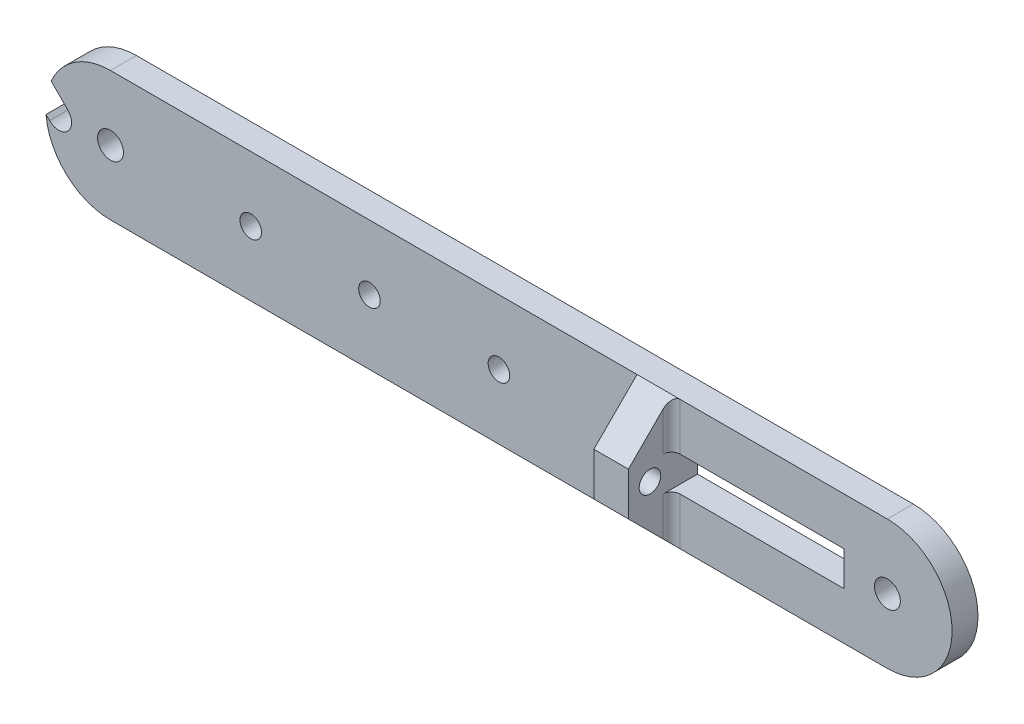
ISO-10303-21;
HEADER;
FILE_DESCRIPTION(('STEP AP214'),'2;1');
FILE_NAME('part.step','',(''),(''),'','','');
FILE_SCHEMA(('AUTOMOTIVE_DESIGN { 1 0 10303 214 1 1 1 1 }'));
ENDSEC;
DATA;
#1=APPLICATION_CONTEXT('core data for automotive mechanical design processes');
#2=APPLICATION_PROTOCOL_DEFINITION('international standard','automotive_design',2000,#1);
#3=PRODUCT_CONTEXT('',#1,'mechanical');
#4=PRODUCT('Part','Part','',(#3));
#5=PRODUCT_RELATED_PRODUCT_CATEGORY('part','',(#4));
#6=PRODUCT_DEFINITION_FORMATION('','',#4);
#7=PRODUCT_DEFINITION_CONTEXT('part definition',#1,'design');
#8=PRODUCT_DEFINITION('design','',#6,#7);
#9=PRODUCT_DEFINITION_SHAPE('','',#8);
#10=(LENGTH_UNIT() NAMED_UNIT(*) SI_UNIT(.MILLI.,.METRE.));
#11=(NAMED_UNIT(*) PLANE_ANGLE_UNIT() SI_UNIT($,.RADIAN.));
#12=(NAMED_UNIT(*) SI_UNIT($,.STERADIAN.) SOLID_ANGLE_UNIT());
#13=UNCERTAINTY_MEASURE_WITH_UNIT(LENGTH_MEASURE(1.E-05),#10,'distance_accuracy_value','');
#14=(GEOMETRIC_REPRESENTATION_CONTEXT(3) GLOBAL_UNCERTAINTY_ASSIGNED_CONTEXT((#13)) GLOBAL_UNIT_ASSIGNED_CONTEXT((#10,
#11,#12)) REPRESENTATION_CONTEXT('',''));
#15=CARTESIAN_POINT('',(0.,0.,0.));
#16=DIRECTION('',(0.,0.,1.));
#17=DIRECTION('',(1.,0.,0.));
#18=AXIS2_PLACEMENT_3D('',#15,#16,#17);
#19=CARTESIAN_POINT('',(90.,0.,6.));
#20=DIRECTION('',(0.,0.,1.));
#21=DIRECTION('',(1.,0.,0.));
#22=AXIS2_PLACEMENT_3D('',#19,#20,#21);
#23=PLANE('',#22);
#24=CARTESIAN_POINT('',(-30.,0.,6.));
#25=DIRECTION('',(0.,0.,1.));
#26=DIRECTION('',(1.,0.,0.));
#27=AXIS2_PLACEMENT_3D('',#24,#25,#26);
#28=CIRCLE('',#27,2.5);
#29=CARTESIAN_POINT('',(-27.5,0.,6.));
#30=VERTEX_POINT('',#29);
#31=EDGE_CURVE('E383',#30,#30,#28,.T.);
#32=ORIENTED_EDGE('',*,*,#31,.F.);
#33=EDGE_LOOP('',(#32));
#34=FACE_BOUND('',#33,.T.);
#35=CARTESIAN_POINT('',(-90.,0.,6.));
#36=DIRECTION('',(0.,0.,1.));
#37=DIRECTION('',(-1.,0.,0.));
#38=AXIS2_PLACEMENT_3D('',#35,#36,#37);
#39=CIRCLE('',#38,3.00000000000001);
#40=CARTESIAN_POINT('',(-93.,0.,6.));
#41=VERTEX_POINT('',#40);
#42=EDGE_CURVE('E395',#41,#41,#39,.T.);
#43=ORIENTED_EDGE('',*,*,#42,.F.);
#44=EDGE_LOOP('',(#43));
#45=FACE_BOUND('',#44,.T.);
#46=CARTESIAN_POINT('',(0.,0.,6.));
#47=DIRECTION('',(0.,0.,1.));
#48=DIRECTION('',(1.,0.,0.));
#49=AXIS2_PLACEMENT_3D('',#46,#47,#48);
#50=CIRCLE('',#49,2.5);
#51=CARTESIAN_POINT('',(2.5,0.,6.));
#52=VERTEX_POINT('',#51);
#53=EDGE_CURVE('E426',#52,#52,#50,.T.);
#54=ORIENTED_EDGE('',*,*,#53,.F.);
#55=EDGE_LOOP('',(#54));
#56=FACE_BOUND('',#55,.T.);
#57=CARTESIAN_POINT('',(-57.5,0.,6.));
#58=DIRECTION('',(0.,0.,1.));
#59=DIRECTION('',(1.,0.,0.));
#60=AXIS2_PLACEMENT_3D('',#57,#58,#59);
#61=CIRCLE('',#60,2.50000000000001);
#62=CARTESIAN_POINT('',(-55.,0.,6.));
#63=VERTEX_POINT('',#62);
#64=EDGE_CURVE('E389',#63,#63,#61,.T.);
#65=ORIENTED_EDGE('',*,*,#64,.F.);
#66=EDGE_LOOP('',(#65));
#67=FACE_BOUND('',#66,.T.);
#68=CARTESIAN_POINT('',(-102.,0.,6.));
#69=DIRECTION('',(0.,0.,1.));
#70=DIRECTION('',(1.,0.,0.));
#71=AXIS2_PLACEMENT_3D('',#68,#69,#70);
#72=CIRCLE('',#71,3.00000000000001);
#73=CARTESIAN_POINT('',(-104.12132034356,-2.12132034355964,6.));
#74=VERTEX_POINT('',#73);
#75=CARTESIAN_POINT('',(-99.8786796564403,2.12132034355964,6.));
#76=VERTEX_POINT('',#75);
#77=EDGE_CURVE('E201',#74,#76,#72,.T.);
#78=ORIENTED_EDGE('',*,*,#77,.F.);
#79=DIRECTION('',(-0.707106781186549,0.707106781186547,0.));
#80=VECTOR('',#79,1.);
#81=CARTESIAN_POINT('',(-53.1213203435595,-53.1213203435596,6.));
#82=LINE('',#81,#80);
#83=CARTESIAN_POINT('',(-104.943648089812,-1.29899259730732,6.));
#84=VERTEX_POINT('',#83);
#85=EDGE_CURVE('E207',#74,#84,#82,.T.);
#86=ORIENTED_EDGE('',*,*,#85,.T.);
#87=CARTESIAN_POINT('',(-90.,0.,6.));
#88=DIRECTION('',(0.,0.,1.));
#89=DIRECTION('',(-1.,0.,0.));
#90=AXIS2_PLACEMENT_3D('',#87,#88,#89);
#91=CIRCLE('',#90,15.);
#92=CARTESIAN_POINT('',(-90.,-15.,6.));
#93=VERTEX_POINT('',#92);
#94=EDGE_CURVE('E351',#84,#93,#91,.T.);
#95=ORIENTED_EDGE('',*,*,#94,.T.);
#96=DIRECTION('',(1.,0.,0.));
#97=VECTOR('',#96,1.);
#98=CARTESIAN_POINT('',(90.,-15.,6.));
#99=LINE('',#98,#97);
#100=CARTESIAN_POINT('',(32.,-15.,6.));
#101=VERTEX_POINT('',#100);
#102=EDGE_CURVE('E353',#93,#101,#99,.T.);
#103=ORIENTED_EDGE('',*,*,#102,.T.);
#104=DIRECTION('',(0.,1.,0.));
#105=VECTOR('',#104,1.);
#106=CARTESIAN_POINT('',(32.,-15.,6.));
#107=LINE('',#106,#105);
#108=CARTESIAN_POINT('',(32.,15.,6.));
#109=VERTEX_POINT('',#108);
#110=EDGE_CURVE('E279',#101,#109,#107,.T.);
#111=ORIENTED_EDGE('',*,*,#110,.T.);
#112=DIRECTION('',(-1.,0.,0.));
#113=VECTOR('',#112,1.);
#114=CARTESIAN_POINT('',(90.,15.,6.));
#115=LINE('',#114,#113);
#116=CARTESIAN_POINT('',(-90.,15.,6.));
#117=VERTEX_POINT('',#116);
#118=EDGE_CURVE('E349',#109,#117,#115,.T.);
#119=ORIENTED_EDGE('',*,*,#118,.T.);
#120=CARTESIAN_POINT('',(-103.750652312537,5.99329299965607,6.));
#121=VERTEX_POINT('',#120);
#122=EDGE_CURVE('E345',#117,#121,#91,.T.);
#123=ORIENTED_EDGE('',*,*,#122,.T.);
#124=DIRECTION('',(-0.707106781186548,0.707106781186547,0.));
#125=VECTOR('',#124,1.);
#126=CARTESIAN_POINT('',(-48.8786796564403,-48.8786796564403,6.));
#127=LINE('',#126,#125);
#128=EDGE_CURVE('E50',#76,#121,#127,.T.);
#129=ORIENTED_EDGE('',*,*,#128,.F.);
#130=EDGE_LOOP('',(#78,#86,#95,#103,#111,#119,#123,#129));
#131=FACE_BOUND('',#130,.T.);
#132=ADVANCED_FACE('F35',(#34,#45,#56,#67,#131),#23,.T.);
#133=CARTESIAN_POINT('',(90.,0.,0.));
#134=DIRECTION('',(0.,0.,1.));
#135=DIRECTION('',(1.,0.,0.));
#136=AXIS2_PLACEMENT_3D('',#133,#134,#135);
#137=PLANE('',#136);
#138=CARTESIAN_POINT('',(-30.,0.,0.));
#139=DIRECTION('',(0.,0.,1.));
#140=DIRECTION('',(1.,0.,0.));
#141=AXIS2_PLACEMENT_3D('',#138,#139,#140);
#142=CIRCLE('',#141,2.5);
#143=CARTESIAN_POINT('',(-27.5,0.,0.));
#144=VERTEX_POINT('',#143);
#145=EDGE_CURVE('E289',#144,#144,#142,.T.);
#146=ORIENTED_EDGE('',*,*,#145,.T.);
#147=EDGE_LOOP('',(#146));
#148=FACE_BOUND('',#147,.T.);
#149=CARTESIAN_POINT('',(-57.5,0.,0.));
#150=DIRECTION('',(0.,0.,1.));
#151=DIRECTION('',(1.,0.,0.));
#152=AXIS2_PLACEMENT_3D('',#149,#150,#151);
#153=CIRCLE('',#152,2.50000000000001);
#154=CARTESIAN_POINT('',(-55.,0.,0.));
#155=VERTEX_POINT('',#154);
#156=EDGE_CURVE('E386',#155,#155,#153,.T.);
#157=ORIENTED_EDGE('',*,*,#156,.T.);
#158=EDGE_LOOP('',(#157));
#159=FACE_BOUND('',#158,.T.);
#160=CARTESIAN_POINT('',(-90.,0.,0.));
#161=DIRECTION('',(0.,0.,1.));
#162=DIRECTION('',(-1.,0.,0.));
#163=AXIS2_PLACEMENT_3D('',#160,#161,#162);
#164=CIRCLE('',#163,3.00000000000001);
#165=CARTESIAN_POINT('',(-93.,0.,0.));
#166=VERTEX_POINT('',#165);
#167=EDGE_CURVE('E392',#166,#166,#164,.T.);
#168=ORIENTED_EDGE('',*,*,#167,.T.);
#169=EDGE_LOOP('',(#168));
#170=FACE_BOUND('',#169,.T.);
#171=DIRECTION('',(0.,1.,0.));
#172=VECTOR('',#171,1.);
#173=CARTESIAN_POINT('',(80.,-4.,0.));
#174=LINE('',#173,#172);
#175=CARTESIAN_POINT('',(80.,-4.,0.));
#176=VERTEX_POINT('',#175);
#177=CARTESIAN_POINT('',(80.,4.,0.));
#178=VERTEX_POINT('',#177);
#179=EDGE_CURVE('E398',#176,#178,#174,.T.);
#180=ORIENTED_EDGE('',*,*,#179,.T.);
#181=DIRECTION('',(-1.,0.,0.));
#182=VECTOR('',#181,1.);
#183=CARTESIAN_POINT('',(40.,4.,0.));
#184=LINE('',#183,#182);
#185=CARTESIAN_POINT('',(40.,4.,0.));
#186=VERTEX_POINT('',#185);
#187=EDGE_CURVE('E406',#178,#186,#184,.T.);
#188=ORIENTED_EDGE('',*,*,#187,.T.);
#189=DIRECTION('',(0.,-1.,0.));
#190=VECTOR('',#189,1.);
#191=CARTESIAN_POINT('',(40.,-4.,0.));
#192=LINE('',#191,#190);
#193=CARTESIAN_POINT('',(40.,-4.,0.));
#194=VERTEX_POINT('',#193);
#195=EDGE_CURVE('E409',#186,#194,#192,.T.);
#196=ORIENTED_EDGE('',*,*,#195,.T.);
#197=DIRECTION('',(1.,0.,0.));
#198=VECTOR('',#197,1.);
#199=CARTESIAN_POINT('',(40.,-4.,0.));
#200=LINE('',#199,#198);
#201=EDGE_CURVE('E403',#194,#176,#200,.T.);
#202=ORIENTED_EDGE('',*,*,#201,.T.);
#203=EDGE_LOOP('',(#180,#188,#196,#202));
#204=FACE_BOUND('',#203,.T.);
#205=CARTESIAN_POINT('',(0.,0.,0.));
#206=DIRECTION('',(0.,0.,1.));
#207=DIRECTION('',(1.,0.,0.));
#208=AXIS2_PLACEMENT_3D('',#205,#206,#207);
#209=CIRCLE('',#208,2.5);
#210=CARTESIAN_POINT('',(2.5,0.,0.));
#211=VERTEX_POINT('',#210);
#212=EDGE_CURVE('E423',#211,#211,#209,.T.);
#213=ORIENTED_EDGE('',*,*,#212,.T.);
#214=EDGE_LOOP('',(#213));
#215=FACE_BOUND('',#214,.T.);
#216=CARTESIAN_POINT('',(90.,0.,0.));
#217=DIRECTION('',(0.,0.,1.));
#218=DIRECTION('',(1.,0.,0.));
#219=AXIS2_PLACEMENT_3D('',#216,#217,#218);
#220=CIRCLE('',#219,3.00000000000001);
#221=CARTESIAN_POINT('',(93.,0.,0.));
#222=VERTEX_POINT('',#221);
#223=EDGE_CURVE('E419',#222,#222,#220,.T.);
#224=ORIENTED_EDGE('',*,*,#223,.T.);
#225=EDGE_LOOP('',(#224));
#226=FACE_BOUND('',#225,.T.);
#227=DIRECTION('',(-0.707106781186549,0.707106781186547,0.));
#228=VECTOR('',#227,1.);
#229=CARTESIAN_POINT('',(-8.12132034355938,-98.1213203435596,0.));
#230=LINE('',#229,#228);
#231=CARTESIAN_POINT('',(-104.12132034356,-2.12132034355964,0.));
#232=VERTEX_POINT('',#231);
#233=CARTESIAN_POINT('',(-104.943648089812,-1.29899259730732,0.));
#234=VERTEX_POINT('',#233);
#235=EDGE_CURVE('E221',#232,#234,#230,.T.);
#236=ORIENTED_EDGE('',*,*,#235,.F.);
#237=CARTESIAN_POINT('',(-102.,0.,0.));
#238=DIRECTION('',(0.,0.,1.));
#239=DIRECTION('',(1.,0.,0.));
#240=AXIS2_PLACEMENT_3D('',#237,#238,#239);
#241=CIRCLE('',#240,3.00000000000001);
#242=CARTESIAN_POINT('',(-99.8786796564403,2.12132034355964,0.));
#243=VERTEX_POINT('',#242);
#244=EDGE_CURVE('E11',#232,#243,#241,.T.);
#245=ORIENTED_EDGE('',*,*,#244,.T.);
#246=DIRECTION('',(-0.707106781186548,0.707106781186547,0.));
#247=VECTOR('',#246,1.);
#248=CARTESIAN_POINT('',(-3.87867965644033,-93.8786796564404,0.));
#249=LINE('',#248,#247);
#250=CARTESIAN_POINT('',(-103.750652312537,5.99329299965608,0.));
#251=VERTEX_POINT('',#250);
#252=EDGE_CURVE('E217',#243,#251,#249,.T.);
#253=ORIENTED_EDGE('',*,*,#252,.T.);
#254=CARTESIAN_POINT('',(-90.,0.,0.));
#255=DIRECTION('',(0.,0.,1.));
#256=DIRECTION('',(-1.,0.,0.));
#257=AXIS2_PLACEMENT_3D('',#254,#255,#256);
#258=CIRCLE('',#257,15.);
#259=CARTESIAN_POINT('',(-90.,15.,0.));
#260=VERTEX_POINT('',#259);
#261=EDGE_CURVE('E347',#260,#251,#258,.T.);
#262=ORIENTED_EDGE('',*,*,#261,.F.);
#263=DIRECTION('',(-1.,0.,0.));
#264=VECTOR('',#263,1.);
#265=CARTESIAN_POINT('',(90.,15.,0.));
#266=LINE('',#265,#264);
#267=CARTESIAN_POINT('',(90.,15.,0.));
#268=VERTEX_POINT('',#267);
#269=EDGE_CURVE('E497',#268,#260,#266,.T.);
#270=ORIENTED_EDGE('',*,*,#269,.F.);
#271=CARTESIAN_POINT('',(90.,0.,0.));
#272=DIRECTION('',(0.,0.,1.));
#273=DIRECTION('',(1.,0.,0.));
#274=AXIS2_PLACEMENT_3D('',#271,#272,#273);
#275=CIRCLE('',#274,15.);
#276=CARTESIAN_POINT('',(90.,-15.,0.));
#277=VERTEX_POINT('',#276);
#278=EDGE_CURVE('E360',#277,#268,#275,.T.);
#279=ORIENTED_EDGE('',*,*,#278,.F.);
#280=DIRECTION('',(1.,0.,0.));
#281=VECTOR('',#280,1.);
#282=CARTESIAN_POINT('',(90.,-15.,0.));
#283=LINE('',#282,#281);
#284=CARTESIAN_POINT('',(-90.,-15.,0.));
#285=VERTEX_POINT('',#284);
#286=EDGE_CURVE('E432',#285,#277,#283,.T.);
#287=ORIENTED_EDGE('',*,*,#286,.F.);
#288=EDGE_CURVE('E442',#234,#285,#258,.T.);
#289=ORIENTED_EDGE('',*,*,#288,.F.);
#290=EDGE_LOOP('',(#236,#245,#253,#262,#270,#279,#287,#289));
#291=FACE_BOUND('',#290,.T.);
#292=ADVANCED_FACE('F478',(#148,#159,#170,#204,#215,#226,#291),#137,.F.);
#293=CARTESIAN_POINT('',(-90.,0.,6.));
#294=DIRECTION('',(0.,0.,-1.));
#295=DIRECTION('',(-1.,0.,0.));
#296=AXIS2_PLACEMENT_3D('',#293,#294,#295);
#297=CYLINDRICAL_SURFACE('',#296,15.);
#298=DIRECTION('',(0.,0.,-1.));
#299=VECTOR('',#298,1.);
#300=CARTESIAN_POINT('',(-104.943648089812,-1.29899259730732,6.));
#301=LINE('',#300,#299);
#302=EDGE_CURVE('E43',#234,#84,#301,.F.);
#303=ORIENTED_EDGE('',*,*,#302,.F.);
#304=ORIENTED_EDGE('',*,*,#288,.T.);
#305=DIRECTION('',(0.,0.,-1.));
#306=VECTOR('',#305,1.);
#307=CARTESIAN_POINT('',(-90.,-15.,6.));
#308=LINE('',#307,#306);
#309=EDGE_CURVE('E446',#93,#285,#308,.T.);
#310=ORIENTED_EDGE('',*,*,#309,.F.);
#311=ORIENTED_EDGE('',*,*,#94,.F.);
#312=EDGE_LOOP('',(#303,#304,#310,#311));
#313=FACE_BOUND('',#312,.T.);
#314=ADVANCED_FACE('F513',(#313),#297,.T.);
#315=CARTESIAN_POINT('',(90.,15.,6.));
#316=VERTEX_POINT('',#315);
#317=CARTESIAN_POINT('',(42.,15.,6.));
#318=VERTEX_POINT('',#317);
#319=EDGE_CURVE('E354',#316,#318,#115,.T.);
#320=ORIENTED_EDGE('',*,*,#319,.T.);
#321=DIRECTION('',(0.,1.,0.));
#322=VECTOR('',#321,1.);
#323=CARTESIAN_POINT('',(42.,4.,6.));
#324=LINE('',#323,#322);
#325=CARTESIAN_POINT('',(42.,4.,6.));
#326=VERTEX_POINT('',#325);
#327=EDGE_CURVE('E324',#318,#326,#324,.F.);
#328=ORIENTED_EDGE('',*,*,#327,.T.);
#329=DIRECTION('',(-1.,0.,0.));
#330=VECTOR('',#329,1.);
#331=CARTESIAN_POINT('',(40.,4.,6.));
#332=LINE('',#331,#330);
#333=CARTESIAN_POINT('',(80.,4.,6.));
#334=VERTEX_POINT('',#333);
#335=EDGE_CURVE('E312',#334,#326,#332,.T.);
#336=ORIENTED_EDGE('',*,*,#335,.F.);
#337=DIRECTION('',(0.,1.,0.));
#338=VECTOR('',#337,1.);
#339=CARTESIAN_POINT('',(80.,-4.,6.));
#340=LINE('',#339,#338);
#341=CARTESIAN_POINT('',(80.,-4.,6.));
#342=VERTEX_POINT('',#341);
#343=EDGE_CURVE('E401',#342,#334,#340,.T.);
#344=ORIENTED_EDGE('',*,*,#343,.F.);
#345=DIRECTION('',(1.,0.,0.));
#346=VECTOR('',#345,1.);
#347=CARTESIAN_POINT('',(40.,-4.,6.));
#348=LINE('',#347,#346);
#349=CARTESIAN_POINT('',(42.,-4.,6.));
#350=VERTEX_POINT('',#349);
#351=EDGE_CURVE('E315',#350,#342,#348,.T.);
#352=ORIENTED_EDGE('',*,*,#351,.F.);
#353=DIRECTION('',(0.,1.,0.));
#354=VECTOR('',#353,1.);
#355=CARTESIAN_POINT('',(42.,-15.,6.));
#356=LINE('',#355,#354);
#357=CARTESIAN_POINT('',(42.,-15.,6.));
#358=VERTEX_POINT('',#357);
#359=EDGE_CURVE('E321',#350,#358,#356,.F.);
#360=ORIENTED_EDGE('',*,*,#359,.T.);
#361=CARTESIAN_POINT('',(90.,-15.,6.));
#362=VERTEX_POINT('',#361);
#363=EDGE_CURVE('E318',#358,#362,#99,.T.);
#364=ORIENTED_EDGE('',*,*,#363,.T.);
#365=CARTESIAN_POINT('',(90.,0.,6.));
#366=DIRECTION('',(0.,0.,1.));
#367=DIRECTION('',(1.,0.,0.));
#368=AXIS2_PLACEMENT_3D('',#365,#366,#367);
#369=CIRCLE('',#368,15.);
#370=EDGE_CURVE('E430',#362,#316,#369,.T.);
#371=ORIENTED_EDGE('',*,*,#370,.T.);
#372=EDGE_LOOP('',(#320,#328,#336,#344,#352,#360,#364,#371));
#373=FACE_BOUND('',#372,.T.);
#374=CARTESIAN_POINT('',(90.,0.,6.));
#375=DIRECTION('',(0.,0.,1.));
#376=DIRECTION('',(1.,0.,0.));
#377=AXIS2_PLACEMENT_3D('',#374,#375,#376);
#378=CIRCLE('',#377,3.00000000000001);
#379=CARTESIAN_POINT('',(93.,0.,6.));
#380=VERTEX_POINT('',#379);
#381=EDGE_CURVE('E420',#380,#380,#378,.T.);
#382=ORIENTED_EDGE('',*,*,#381,.F.);
#383=EDGE_LOOP('',(#382));
#384=FACE_BOUND('',#383,.T.);
#385=ADVANCED_FACE('F453',(#373,#384),#23,.T.);
#386=CARTESIAN_POINT('',(90.,0.,6.));
#387=DIRECTION('',(0.,0.,-1.));
#388=DIRECTION('',(-1.,0.,0.));
#389=AXIS2_PLACEMENT_3D('',#386,#387,#388);
#390=CYLINDRICAL_SURFACE('',#389,15.);
#391=ORIENTED_EDGE('',*,*,#278,.T.);
#392=DIRECTION('',(0.,0.,-1.));
#393=VECTOR('',#392,1.);
#394=CARTESIAN_POINT('',(90.,15.,6.));
#395=LINE('',#394,#393);
#396=EDGE_CURVE('E450',#316,#268,#395,.T.);
#397=ORIENTED_EDGE('',*,*,#396,.F.);
#398=ORIENTED_EDGE('',*,*,#370,.F.);
#399=DIRECTION('',(0.,0.,-1.));
#400=VECTOR('',#399,1.);
#401=CARTESIAN_POINT('',(90.,-15.,6.));
#402=LINE('',#401,#400);
#403=EDGE_CURVE('E367',#362,#277,#402,.T.);
#404=ORIENTED_EDGE('',*,*,#403,.T.);
#405=EDGE_LOOP('',(#391,#397,#398,#404));
#406=FACE_BOUND('',#405,.T.);
#407=ADVANCED_FACE('F495',(#406),#390,.T.);
#408=CARTESIAN_POINT('',(90.,15.,6.));
#409=DIRECTION('',(0.,-1.,0.));
#410=DIRECTION('',(0.,0.,-1.));
#411=AXIS2_PLACEMENT_3D('',#408,#409,#410);
#412=PLANE('',#411);
#413=ORIENTED_EDGE('',*,*,#269,.T.);
#414=DIRECTION('',(0.,0.,-1.));
#415=VECTOR('',#414,1.);
#416=CARTESIAN_POINT('',(-90.,15.,6.));
#417=LINE('',#416,#415);
#418=EDGE_CURVE('E448',#117,#260,#417,.T.);
#419=ORIENTED_EDGE('',*,*,#418,.F.);
#420=ORIENTED_EDGE('',*,*,#118,.F.);
#421=DIRECTION('',(1.,0.,0.));
#422=VECTOR('',#421,1.);
#423=CARTESIAN_POINT('',(32.,15.,6.));
#424=LINE('',#423,#422);
#425=EDGE_CURVE('E296',#109,#318,#424,.T.);
#426=ORIENTED_EDGE('',*,*,#425,.T.);
#427=ORIENTED_EDGE('',*,*,#319,.F.);
#428=ORIENTED_EDGE('',*,*,#396,.T.);
#429=EDGE_LOOP('',(#413,#419,#420,#426,#427,#428));
#430=FACE_BOUND('',#429,.T.);
#431=ADVANCED_FACE('F496',(#430),#412,.F.);
#432=ORIENTED_EDGE('',*,*,#261,.T.);
#433=DIRECTION('',(0.,0.,-1.));
#434=VECTOR('',#433,1.);
#435=CARTESIAN_POINT('',(-103.750652312537,5.99329299965608,6.));
#436=LINE('',#435,#434);
#437=EDGE_CURVE('E337',#251,#121,#436,.F.);
#438=ORIENTED_EDGE('',*,*,#437,.T.);
#439=ORIENTED_EDGE('',*,*,#122,.F.);
#440=ORIENTED_EDGE('',*,*,#418,.T.);
#441=EDGE_LOOP('',(#432,#438,#439,#440));
#442=FACE_BOUND('',#441,.T.);
#443=ADVANCED_FACE('F343',(#442),#297,.T.);
#444=CARTESIAN_POINT('',(90.,-15.,6.));
#445=DIRECTION('',(0.,1.,0.));
#446=DIRECTION('',(0.,0.,1.));
#447=AXIS2_PLACEMENT_3D('',#444,#445,#446);
#448=PLANE('',#447);
#449=ORIENTED_EDGE('',*,*,#286,.T.);
#450=ORIENTED_EDGE('',*,*,#403,.F.);
#451=ORIENTED_EDGE('',*,*,#363,.F.);
#452=DIRECTION('',(1.,0.,0.));
#453=VECTOR('',#452,1.);
#454=CARTESIAN_POINT('',(32.,-15.,6.));
#455=LINE('',#454,#453);
#456=EDGE_CURVE('E287',#101,#358,#455,.T.);
#457=ORIENTED_EDGE('',*,*,#456,.F.);
#458=ORIENTED_EDGE('',*,*,#102,.F.);
#459=ORIENTED_EDGE('',*,*,#309,.T.);
#460=EDGE_LOOP('',(#449,#450,#451,#457,#458,#459));
#461=FACE_BOUND('',#460,.T.);
#462=ADVANCED_FACE('F490',(#461),#448,.F.);
#463=CARTESIAN_POINT('',(0.,0.,6.));
#464=DIRECTION('',(0.,0.,-1.));
#465=DIRECTION('',(-1.,0.,0.));
#466=AXIS2_PLACEMENT_3D('',#463,#464,#465);
#467=CYLINDRICAL_SURFACE('',#466,2.5);
#468=ORIENTED_EDGE('',*,*,#53,.T.);
#469=EDGE_LOOP('',(#468));
#470=FACE_BOUND('',#469,.T.);
#471=ORIENTED_EDGE('',*,*,#212,.F.);
#472=EDGE_LOOP('',(#471));
#473=FACE_BOUND('',#472,.T.);
#474=ADVANCED_FACE('F536',(#470,#473),#467,.F.);
#475=CARTESIAN_POINT('',(90.,0.,6.));
#476=DIRECTION('',(0.,0.,-1.));
#477=DIRECTION('',(-1.,0.,0.));
#478=AXIS2_PLACEMENT_3D('',#475,#476,#477);
#479=CYLINDRICAL_SURFACE('',#478,3.00000000000001);
#480=ORIENTED_EDGE('',*,*,#381,.T.);
#481=EDGE_LOOP('',(#480));
#482=FACE_BOUND('',#481,.T.);
#483=ORIENTED_EDGE('',*,*,#223,.F.);
#484=EDGE_LOOP('',(#483));
#485=FACE_BOUND('',#484,.T.);
#486=ADVANCED_FACE('F589',(#482,#485),#479,.F.);
#487=CARTESIAN_POINT('',(80.,-4.,6.));
#488=DIRECTION('',(-1.,0.,0.));
#489=DIRECTION('',(0.,0.,1.));
#490=AXIS2_PLACEMENT_3D('',#487,#488,#489);
#491=PLANE('',#490);
#492=ORIENTED_EDGE('',*,*,#179,.F.);
#493=DIRECTION('',(0.,0.,-1.));
#494=VECTOR('',#493,1.);
#495=CARTESIAN_POINT('',(80.,-4.,6.));
#496=LINE('',#495,#494);
#497=EDGE_CURVE('E307',#342,#176,#496,.T.);
#498=ORIENTED_EDGE('',*,*,#497,.F.);
#499=ORIENTED_EDGE('',*,*,#343,.T.);
#500=DIRECTION('',(0.,0.,-1.));
#501=VECTOR('',#500,1.);
#502=CARTESIAN_POINT('',(80.,4.,6.));
#503=LINE('',#502,#501);
#504=EDGE_CURVE('E416',#334,#178,#503,.T.);
#505=ORIENTED_EDGE('',*,*,#504,.T.);
#506=EDGE_LOOP('',(#492,#498,#499,#505));
#507=FACE_BOUND('',#506,.T.);
#508=ADVANCED_FACE('F473',(#507),#491,.T.);
#509=CARTESIAN_POINT('',(40.,4.,6.));
#510=DIRECTION('',(0.,-1.,0.));
#511=DIRECTION('',(0.,0.,-1.));
#512=AXIS2_PLACEMENT_3D('',#509,#510,#511);
#513=PLANE('',#512);
#514=ORIENTED_EDGE('',*,*,#187,.F.);
#515=ORIENTED_EDGE('',*,*,#504,.F.);
#516=ORIENTED_EDGE('',*,*,#335,.T.);
#517=CARTESIAN_POINT('',(42.,4.,8.));
#518=DIRECTION('',(0.,-1.,0.));
#519=DIRECTION('',(0.,0.,-1.));
#520=AXIS2_PLACEMENT_3D('',#517,#518,#519);
#521=CIRCLE('',#520,2.);
#522=CARTESIAN_POINT('',(40.,4.,8.));
#523=VERTEX_POINT('',#522);
#524=EDGE_CURVE('E330',#326,#523,#521,.F.);
#525=ORIENTED_EDGE('',*,*,#524,.T.);
#526=DIRECTION('',(0.,0.,-1.));
#527=VECTOR('',#526,1.);
#528=CARTESIAN_POINT('',(40.,4.,6.));
#529=LINE('',#528,#527);
#530=EDGE_CURVE('E306',#523,#186,#529,.T.);
#531=ORIENTED_EDGE('',*,*,#530,.T.);
#532=EDGE_LOOP('',(#514,#515,#516,#525,#531));
#533=FACE_BOUND('',#532,.T.);
#534=ADVANCED_FACE('F465',(#533),#513,.T.);
#535=CARTESIAN_POINT('',(40.,-4.,6.));
#536=DIRECTION('',(1.,0.,0.));
#537=DIRECTION('',(0.,0.,-1.));
#538=AXIS2_PLACEMENT_3D('',#535,#536,#537);
#539=PLANE('',#538);
#540=ORIENTED_EDGE('',*,*,#530,.F.);
#541=DIRECTION('',(0.,1.,0.));
#542=VECTOR('',#541,1.);
#543=CARTESIAN_POINT('',(40.,15.,8.));
#544=LINE('',#543,#542);
#545=CARTESIAN_POINT('',(40.,13.,8.));
#546=VERTEX_POINT('',#545);
#547=EDGE_CURVE('E325',#523,#546,#544,.T.);
#548=ORIENTED_EDGE('',*,*,#547,.T.);
#549=DIRECTION('',(0.,-0.707106781186548,0.707106781186548));
#550=VECTOR('',#549,1.);
#551=CARTESIAN_POINT('',(40.,15.,6.));
#552=LINE('',#551,#550);
#553=CARTESIAN_POINT('',(40.,5.,16.));
#554=VERTEX_POINT('',#553);
#555=EDGE_CURVE('E273',#546,#554,#552,.T.);
#556=ORIENTED_EDGE('',*,*,#555,.T.);
#557=DIRECTION('',(0.,-1.,0.));
#558=VECTOR('',#557,1.);
#559=CARTESIAN_POINT('',(40.,5.,16.));
#560=LINE('',#559,#558);
#561=CARTESIAN_POINT('',(40.,-5.,16.));
#562=VERTEX_POINT('',#561);
#563=EDGE_CURVE('E301',#554,#562,#560,.T.);
#564=ORIENTED_EDGE('',*,*,#563,.T.);
#565=DIRECTION('',(0.,-0.707106781186547,-0.707106781186548));
#566=VECTOR('',#565,1.);
#567=CARTESIAN_POINT('',(40.,-15.,6.));
#568=LINE('',#567,#566);
#569=CARTESIAN_POINT('',(40.,-13.,8.));
#570=VERTEX_POINT('',#569);
#571=EDGE_CURVE('E284',#562,#570,#568,.T.);
#572=ORIENTED_EDGE('',*,*,#571,.T.);
#573=DIRECTION('',(0.,1.,0.));
#574=VECTOR('',#573,1.);
#575=CARTESIAN_POINT('',(40.,-4.,8.));
#576=LINE('',#575,#574);
#577=CARTESIAN_POINT('',(40.,-4.,8.));
#578=VERTEX_POINT('',#577);
#579=EDGE_CURVE('E452',#570,#578,#576,.T.);
#580=ORIENTED_EDGE('',*,*,#579,.T.);
#581=DIRECTION('',(0.,0.,-1.));
#582=VECTOR('',#581,1.);
#583=CARTESIAN_POINT('',(40.,-4.,6.));
#584=LINE('',#583,#582);
#585=EDGE_CURVE('E304',#578,#194,#584,.T.);
#586=ORIENTED_EDGE('',*,*,#585,.T.);
#587=ORIENTED_EDGE('',*,*,#195,.F.);
#588=EDGE_LOOP('',(#540,#548,#556,#564,#572,#580,#586,#587));
#589=FACE_BOUND('',#588,.T.);
#590=CARTESIAN_POINT('',(40.,0.,11.));
#591=DIRECTION('',(1.,0.,0.));
#592=DIRECTION('',(0.,0.,-1.));
#593=AXIS2_PLACEMENT_3D('',#590,#591,#592);
#594=CIRCLE('',#593,2.5);
#595=CARTESIAN_POINT('',(40.,0.,8.5));
#596=VERTEX_POINT('',#595);
#597=EDGE_CURVE('E270',#596,#596,#594,.T.);
#598=ORIENTED_EDGE('',*,*,#597,.F.);
#599=EDGE_LOOP('',(#598));
#600=FACE_BOUND('',#599,.T.);
#601=ADVANCED_FACE('F481',(#589,#600),#539,.T.);
#602=CARTESIAN_POINT('',(40.,-4.,6.));
#603=DIRECTION('',(0.,1.,0.));
#604=DIRECTION('',(0.,0.,1.));
#605=AXIS2_PLACEMENT_3D('',#602,#603,#604);
#606=PLANE('',#605);
#607=ORIENTED_EDGE('',*,*,#201,.F.);
#608=ORIENTED_EDGE('',*,*,#585,.F.);
#609=CARTESIAN_POINT('',(42.,-4.,8.));
#610=DIRECTION('',(0.,1.,0.));
#611=DIRECTION('',(0.,0.,1.));
#612=AXIS2_PLACEMENT_3D('',#609,#610,#611);
#613=CIRCLE('',#612,2.);
#614=EDGE_CURVE('E333',#578,#350,#613,.F.);
#615=ORIENTED_EDGE('',*,*,#614,.T.);
#616=ORIENTED_EDGE('',*,*,#351,.T.);
#617=ORIENTED_EDGE('',*,*,#497,.T.);
#618=EDGE_LOOP('',(#607,#608,#615,#616,#617));
#619=FACE_BOUND('',#618,.T.);
#620=ADVANCED_FACE('F476',(#619),#606,.T.);
#621=CARTESIAN_POINT('',(-90.,0.,6.));
#622=DIRECTION('',(0.,0.,-1.));
#623=DIRECTION('',(-1.,0.,0.));
#624=AXIS2_PLACEMENT_3D('',#621,#622,#623);
#625=CYLINDRICAL_SURFACE('',#624,3.00000000000001);
#626=ORIENTED_EDGE('',*,*,#42,.T.);
#627=EDGE_LOOP('',(#626));
#628=FACE_BOUND('',#627,.T.);
#629=ORIENTED_EDGE('',*,*,#167,.F.);
#630=EDGE_LOOP('',(#629));
#631=FACE_BOUND('',#630,.T.);
#632=ADVANCED_FACE('F576',(#628,#631),#625,.F.);
#633=CARTESIAN_POINT('',(-57.5,0.,6.));
#634=DIRECTION('',(0.,0.,-1.));
#635=DIRECTION('',(-1.,0.,0.));
#636=AXIS2_PLACEMENT_3D('',#633,#634,#635);
#637=CYLINDRICAL_SURFACE('',#636,2.50000000000001);
#638=ORIENTED_EDGE('',*,*,#64,.T.);
#639=EDGE_LOOP('',(#638));
#640=FACE_BOUND('',#639,.T.);
#641=ORIENTED_EDGE('',*,*,#156,.F.);
#642=EDGE_LOOP('',(#641));
#643=FACE_BOUND('',#642,.T.);
#644=ADVANCED_FACE('F572',(#640,#643),#637,.F.);
#645=CARTESIAN_POINT('',(-30.,0.,6.));
#646=DIRECTION('',(0.,0.,-1.));
#647=DIRECTION('',(-1.,0.,0.));
#648=AXIS2_PLACEMENT_3D('',#645,#646,#647);
#649=CYLINDRICAL_SURFACE('',#648,2.5);
#650=ORIENTED_EDGE('',*,*,#31,.T.);
#651=EDGE_LOOP('',(#650));
#652=FACE_BOUND('',#651,.T.);
#653=ORIENTED_EDGE('',*,*,#145,.F.);
#654=EDGE_LOOP('',(#653));
#655=FACE_BOUND('',#654,.T.);
#656=ADVANCED_FACE('F563',(#652,#655),#649,.F.);
#657=CARTESIAN_POINT('',(32.,-15.,6.));
#658=DIRECTION('',(0.,-0.707106781186548,0.707106781186547));
#659=DIRECTION('',(0.,-0.707106781186547,-0.707106781186548));
#660=AXIS2_PLACEMENT_3D('',#657,#658,#659);
#661=PLANE('',#660);
#662=ORIENTED_EDGE('',*,*,#571,.F.);
#663=DIRECTION('',(1.,0.,0.));
#664=VECTOR('',#663,1.);
#665=CARTESIAN_POINT('',(32.,-5.,16.));
#666=LINE('',#665,#664);
#667=CARTESIAN_POINT('',(32.,-5.,16.));
#668=VERTEX_POINT('',#667);
#669=EDGE_CURVE('E290',#668,#562,#666,.T.);
#670=ORIENTED_EDGE('',*,*,#669,.F.);
#671=DIRECTION('',(0.,-0.707106781186547,-0.707106781186548));
#672=VECTOR('',#671,1.);
#673=CARTESIAN_POINT('',(32.,-15.,6.));
#674=LINE('',#673,#672);
#675=EDGE_CURVE('E293',#668,#101,#674,.T.);
#676=ORIENTED_EDGE('',*,*,#675,.T.);
#677=ORIENTED_EDGE('',*,*,#456,.T.);
#678=CARTESIAN_POINT('',(42.,-13.,8.));
#679=DIRECTION('',(0.,-0.707106781186548,0.707106781186547));
#680=DIRECTION('',(0.,-0.707106781186547,-0.707106781186548));
#681=AXIS2_PLACEMENT_3D('',#678,#679,#680);
#682=ELLIPSE('',#681,2.82842712474619,2.);
#683=EDGE_CURVE('E335',#358,#570,#682,.F.);
#684=ORIENTED_EDGE('',*,*,#683,.T.);
#685=EDGE_LOOP('',(#662,#670,#676,#677,#684));
#686=FACE_BOUND('',#685,.T.);
#687=ADVANCED_FACE('F559',(#686),#661,.T.);
#688=CARTESIAN_POINT('',(32.,5.,16.));
#689=DIRECTION('',(0.,0.,1.));
#690=DIRECTION('',(1.,0.,0.));
#691=AXIS2_PLACEMENT_3D('',#688,#689,#690);
#692=PLANE('',#691);
#693=ORIENTED_EDGE('',*,*,#563,.F.);
#694=DIRECTION('',(1.,0.,0.));
#695=VECTOR('',#694,1.);
#696=CARTESIAN_POINT('',(32.,5.,16.));
#697=LINE('',#696,#695);
#698=CARTESIAN_POINT('',(32.,5.,16.));
#699=VERTEX_POINT('',#698);
#700=EDGE_CURVE('E372',#699,#554,#697,.T.);
#701=ORIENTED_EDGE('',*,*,#700,.F.);
#702=DIRECTION('',(0.,-1.,0.));
#703=VECTOR('',#702,1.);
#704=CARTESIAN_POINT('',(32.,5.,16.));
#705=LINE('',#704,#703);
#706=EDGE_CURVE('E276',#699,#668,#705,.T.);
#707=ORIENTED_EDGE('',*,*,#706,.T.);
#708=ORIENTED_EDGE('',*,*,#669,.T.);
#709=EDGE_LOOP('',(#693,#701,#707,#708));
#710=FACE_BOUND('',#709,.T.);
#711=ADVANCED_FACE('F562',(#710),#692,.T.);
#712=CARTESIAN_POINT('',(32.,15.,6.));
#713=DIRECTION('',(0.,0.707106781186547,0.707106781186547));
#714=DIRECTION('',(0.,-0.707106781186548,0.707106781186548));
#715=AXIS2_PLACEMENT_3D('',#712,#713,#714);
#716=PLANE('',#715);
#717=ORIENTED_EDGE('',*,*,#555,.F.);
#718=CARTESIAN_POINT('',(42.,13.,8.));
#719=DIRECTION('',(0.,0.707106781186547,0.707106781186547));
#720=DIRECTION('',(0.,-0.707106781186548,0.707106781186548));
#721=AXIS2_PLACEMENT_3D('',#718,#719,#720);
#722=ELLIPSE('',#721,2.82842712474619,2.);
#723=EDGE_CURVE('E327',#546,#318,#722,.F.);
#724=ORIENTED_EDGE('',*,*,#723,.T.);
#725=ORIENTED_EDGE('',*,*,#425,.F.);
#726=DIRECTION('',(0.,-0.707106781186548,0.707106781186548));
#727=VECTOR('',#726,1.);
#728=CARTESIAN_POINT('',(32.,15.,6.));
#729=LINE('',#728,#727);
#730=EDGE_CURVE('E283',#109,#699,#729,.T.);
#731=ORIENTED_EDGE('',*,*,#730,.T.);
#732=ORIENTED_EDGE('',*,*,#700,.T.);
#733=EDGE_LOOP('',(#717,#724,#725,#731,#732));
#734=FACE_BOUND('',#733,.T.);
#735=ADVANCED_FACE('F458',(#734),#716,.T.);
#736=CARTESIAN_POINT('',(32.,0.,0.));
#737=DIRECTION('',(1.,0.,0.));
#738=DIRECTION('',(0.,0.,-1.));
#739=AXIS2_PLACEMENT_3D('',#736,#737,#738);
#740=PLANE('',#739);
#741=DIRECTION('',(0.,0.500000000000001,-0.866025403784438));
#742=VECTOR('',#741,1.);
#743=CARTESIAN_POINT('',(32.,4.,11.));
#744=LINE('',#743,#742);
#745=CARTESIAN_POINT('',(32.,1.99999999999999,14.4641016151378));
#746=VERTEX_POINT('',#745);
#747=CARTESIAN_POINT('',(32.,4.,11.));
#748=VERTEX_POINT('',#747);
#749=EDGE_CURVE('E244',#746,#748,#744,.T.);
#750=ORIENTED_EDGE('',*,*,#749,.F.);
#751=DIRECTION('',(0.,1.,0.));
#752=VECTOR('',#751,1.);
#753=CARTESIAN_POINT('',(32.,1.99999999999999,14.4641016151378));
#754=LINE('',#753,#752);
#755=CARTESIAN_POINT('',(32.,-2.00000000000002,14.4641016151377));
#756=VERTEX_POINT('',#755);
#757=EDGE_CURVE('E58',#756,#746,#754,.T.);
#758=ORIENTED_EDGE('',*,*,#757,.F.);
#759=DIRECTION('',(0.,0.499999999999998,0.86602540378444));
#760=VECTOR('',#759,1.);
#761=CARTESIAN_POINT('',(32.,-2.00000000000002,14.4641016151377));
#762=LINE('',#761,#760);
#763=CARTESIAN_POINT('',(32.,-4.,11.));
#764=VERTEX_POINT('',#763);
#765=EDGE_CURVE('E227',#764,#756,#762,.T.);
#766=ORIENTED_EDGE('',*,*,#765,.F.);
#767=DIRECTION('',(0.,-0.499999999999998,0.86602540378444));
#768=VECTOR('',#767,1.);
#769=CARTESIAN_POINT('',(32.,-2.00000000000002,7.53589838486225));
#770=LINE('',#769,#768);
#771=CARTESIAN_POINT('',(32.,-2.00000000000002,7.53589838486225));
#772=VERTEX_POINT('',#771);
#773=EDGE_CURVE('E253',#772,#764,#770,.T.);
#774=ORIENTED_EDGE('',*,*,#773,.F.);
#775=DIRECTION('',(0.,-1.,0.));
#776=VECTOR('',#775,1.);
#777=CARTESIAN_POINT('',(32.,1.99999999999999,7.53589838486224));
#778=LINE('',#777,#776);
#779=CARTESIAN_POINT('',(32.,1.99999999999999,7.53589838486224));
#780=VERTEX_POINT('',#779);
#781=EDGE_CURVE('E250',#780,#772,#778,.T.);
#782=ORIENTED_EDGE('',*,*,#781,.F.);
#783=DIRECTION('',(0.,-0.500000000000001,-0.866025403784438));
#784=VECTOR('',#783,1.);
#785=CARTESIAN_POINT('',(32.,4.,11.));
#786=LINE('',#785,#784);
#787=EDGE_CURVE('E247',#748,#780,#786,.T.);
#788=ORIENTED_EDGE('',*,*,#787,.F.);
#789=EDGE_LOOP('',(#750,#758,#766,#774,#782,#788));
#790=FACE_BOUND('',#789,.T.);
#791=ORIENTED_EDGE('',*,*,#110,.F.);
#792=ORIENTED_EDGE('',*,*,#675,.F.);
#793=ORIENTED_EDGE('',*,*,#706,.F.);
#794=ORIENTED_EDGE('',*,*,#730,.F.);
#795=EDGE_LOOP('',(#791,#792,#793,#794));
#796=FACE_BOUND('',#795,.T.);
#797=ADVANCED_FACE('F546',(#790,#796),#740,.F.);
#798=CARTESIAN_POINT('',(32.,0.,11.));
#799=DIRECTION('',(1.,0.,0.));
#800=DIRECTION('',(0.,0.,-1.));
#801=AXIS2_PLACEMENT_3D('',#798,#799,#800);
#802=CYLINDRICAL_SURFACE('',#801,2.5);
#803=CARTESIAN_POINT('',(36.,0.,11.));
#804=DIRECTION('',(1.,0.,0.));
#805=DIRECTION('',(0.,0.,-1.));
#806=AXIS2_PLACEMENT_3D('',#803,#804,#805);
#807=CIRCLE('',#806,2.5);
#808=CARTESIAN_POINT('',(36.,0.,8.5));
#809=VERTEX_POINT('',#808);
#810=EDGE_CURVE('E260',#809,#809,#807,.F.);
#811=ORIENTED_EDGE('',*,*,#810,.T.);
#812=EDGE_LOOP('',(#811));
#813=FACE_BOUND('',#812,.T.);
#814=ORIENTED_EDGE('',*,*,#597,.T.);
#815=EDGE_LOOP('',(#814));
#816=FACE_BOUND('',#815,.T.);
#817=ADVANCED_FACE('F540',(#813,#816),#802,.F.);
#818=CARTESIAN_POINT('',(42.,-4.,8.));
#819=DIRECTION('',(0.,-1.,0.));
#820=DIRECTION('',(0.,0.,-1.));
#821=AXIS2_PLACEMENT_3D('',#818,#819,#820);
#822=CYLINDRICAL_SURFACE('',#821,2.);
#823=ORIENTED_EDGE('',*,*,#524,.F.);
#824=ORIENTED_EDGE('',*,*,#327,.F.);
#825=ORIENTED_EDGE('',*,*,#723,.F.);
#826=ORIENTED_EDGE('',*,*,#547,.F.);
#827=EDGE_LOOP('',(#823,#824,#825,#826));
#828=FACE_BOUND('',#827,.T.);
#829=ADVANCED_FACE('F463',(#828),#822,.F.);
#830=CARTESIAN_POINT('',(42.,-4.,8.));
#831=DIRECTION('',(0.,-1.,0.));
#832=DIRECTION('',(0.,0.,-1.));
#833=AXIS2_PLACEMENT_3D('',#830,#831,#832);
#834=CYLINDRICAL_SURFACE('',#833,2.);
#835=ORIENTED_EDGE('',*,*,#683,.F.);
#836=ORIENTED_EDGE('',*,*,#359,.F.);
#837=ORIENTED_EDGE('',*,*,#614,.F.);
#838=ORIENTED_EDGE('',*,*,#579,.F.);
#839=EDGE_LOOP('',(#835,#836,#837,#838));
#840=FACE_BOUND('',#839,.T.);
#841=ADVANCED_FACE('F37',(#840),#834,.F.);
#842=CARTESIAN_POINT('',(36.,0.,0.));
#843=DIRECTION('',(1.,0.,0.));
#844=DIRECTION('',(0.,0.,-1.));
#845=AXIS2_PLACEMENT_3D('',#842,#843,#844);
#846=PLANE('',#845);
#847=DIRECTION('',(0.,1.,0.));
#848=VECTOR('',#847,1.);
#849=CARTESIAN_POINT('',(36.,1.99999999999999,14.4641016151378));
#850=LINE('',#849,#848);
#851=CARTESIAN_POINT('',(36.,-2.00000000000002,14.4641016151377));
#852=VERTEX_POINT('',#851);
#853=CARTESIAN_POINT('',(36.,1.99999999999999,14.4641016151378));
#854=VERTEX_POINT('',#853);
#855=EDGE_CURVE('E223',#852,#854,#850,.T.);
#856=ORIENTED_EDGE('',*,*,#855,.T.);
#857=DIRECTION('',(0.,0.500000000000001,-0.866025403784438));
#858=VECTOR('',#857,1.);
#859=CARTESIAN_POINT('',(36.,4.,11.));
#860=LINE('',#859,#858);
#861=CARTESIAN_POINT('',(36.,4.,11.));
#862=VERTEX_POINT('',#861);
#863=EDGE_CURVE('E226',#854,#862,#860,.T.);
#864=ORIENTED_EDGE('',*,*,#863,.T.);
#865=DIRECTION('',(0.,-0.500000000000001,-0.866025403784438));
#866=VECTOR('',#865,1.);
#867=CARTESIAN_POINT('',(36.,4.,11.));
#868=LINE('',#867,#866);
#869=CARTESIAN_POINT('',(36.,1.99999999999999,7.53589838486224));
#870=VERTEX_POINT('',#869);
#871=EDGE_CURVE('E230',#862,#870,#868,.T.);
#872=ORIENTED_EDGE('',*,*,#871,.T.);
#873=DIRECTION('',(0.,-1.,0.));
#874=VECTOR('',#873,1.);
#875=CARTESIAN_POINT('',(36.,1.99999999999999,7.53589838486224));
#876=LINE('',#875,#874);
#877=CARTESIAN_POINT('',(36.,-2.00000000000002,7.53589838486225));
#878=VERTEX_POINT('',#877);
#879=EDGE_CURVE('E233',#870,#878,#876,.T.);
#880=ORIENTED_EDGE('',*,*,#879,.T.);
#881=DIRECTION('',(0.,-0.499999999999998,0.86602540378444));
#882=VECTOR('',#881,1.);
#883=CARTESIAN_POINT('',(36.,-2.00000000000002,7.53589838486225));
#884=LINE('',#883,#882);
#885=CARTESIAN_POINT('',(36.,-4.,11.));
#886=VERTEX_POINT('',#885);
#887=EDGE_CURVE('E236',#878,#886,#884,.T.);
#888=ORIENTED_EDGE('',*,*,#887,.T.);
#889=DIRECTION('',(0.,0.499999999999998,0.86602540378444));
#890=VECTOR('',#889,1.);
#891=CARTESIAN_POINT('',(36.,-2.00000000000002,14.4641016151377));
#892=LINE('',#891,#890);
#893=EDGE_CURVE('E239',#886,#852,#892,.T.);
#894=ORIENTED_EDGE('',*,*,#893,.T.);
#895=EDGE_LOOP('',(#856,#864,#872,#880,#888,#894));
#896=FACE_BOUND('',#895,.T.);
#897=ORIENTED_EDGE('',*,*,#810,.F.);
#898=EDGE_LOOP('',(#897));
#899=FACE_BOUND('',#898,.T.);
#900=ADVANCED_FACE('F545',(#896,#899),#846,.F.);
#901=CARTESIAN_POINT('',(36.,1.99999999999999,14.4641016151378));
#902=DIRECTION('',(0.,0.,1.));
#903=DIRECTION('',(0.,-1.,0.));
#904=AXIS2_PLACEMENT_3D('',#901,#902,#903);
#905=PLANE('',#904);
#906=ORIENTED_EDGE('',*,*,#757,.T.);
#907=DIRECTION('',(-1.,0.,0.));
#908=VECTOR('',#907,1.);
#909=CARTESIAN_POINT('',(36.,1.99999999999999,14.4641016151378));
#910=LINE('',#909,#908);
#911=EDGE_CURVE('E242',#854,#746,#910,.T.);
#912=ORIENTED_EDGE('',*,*,#911,.F.);
#913=ORIENTED_EDGE('',*,*,#855,.F.);
#914=DIRECTION('',(-1.,0.,0.));
#915=VECTOR('',#914,1.);
#916=CARTESIAN_POINT('',(36.,-2.00000000000002,14.4641016151377));
#917=LINE('',#916,#915);
#918=EDGE_CURVE('E258',#852,#756,#917,.T.);
#919=ORIENTED_EDGE('',*,*,#918,.T.);
#920=EDGE_LOOP('',(#906,#912,#913,#919));
#921=FACE_BOUND('',#920,.T.);
#922=ADVANCED_FACE('F556',(#921),#905,.F.);
#923=CARTESIAN_POINT('',(36.,-2.00000000000002,14.4641016151377));
#924=DIRECTION('',(0.,-0.86602540378444,0.499999999999998));
#925=DIRECTION('',(0.,-0.499999999999998,-0.86602540378444));
#926=AXIS2_PLACEMENT_3D('',#923,#924,#925);
#927=PLANE('',#926);
#928=ORIENTED_EDGE('',*,*,#765,.T.);
#929=ORIENTED_EDGE('',*,*,#918,.F.);
#930=ORIENTED_EDGE('',*,*,#893,.F.);
#931=DIRECTION('',(-1.,0.,0.));
#932=VECTOR('',#931,1.);
#933=CARTESIAN_POINT('',(36.,-4.,11.));
#934=LINE('',#933,#932);
#935=EDGE_CURVE('E261',#886,#764,#934,.T.);
#936=ORIENTED_EDGE('',*,*,#935,.T.);
#937=EDGE_LOOP('',(#928,#929,#930,#936));
#938=FACE_BOUND('',#937,.T.);
#939=ADVANCED_FACE('F688',(#938),#927,.F.);
#940=CARTESIAN_POINT('',(36.,-2.00000000000002,7.53589838486225));
#941=DIRECTION('',(0.,-0.86602540378444,-0.499999999999998));
#942=DIRECTION('',(0.,0.499999999999998,-0.86602540378444));
#943=AXIS2_PLACEMENT_3D('',#940,#941,#942);
#944=PLANE('',#943);
#945=ORIENTED_EDGE('',*,*,#773,.T.);
#946=ORIENTED_EDGE('',*,*,#935,.F.);
#947=ORIENTED_EDGE('',*,*,#887,.F.);
#948=DIRECTION('',(-1.,0.,0.));
#949=VECTOR('',#948,1.);
#950=CARTESIAN_POINT('',(36.,-2.00000000000002,7.53589838486225));
#951=LINE('',#950,#949);
#952=EDGE_CURVE('E263',#878,#772,#951,.T.);
#953=ORIENTED_EDGE('',*,*,#952,.T.);
#954=EDGE_LOOP('',(#945,#946,#947,#953));
#955=FACE_BOUND('',#954,.T.);
#956=ADVANCED_FACE('F696',(#955),#944,.F.);
#957=CARTESIAN_POINT('',(36.,1.99999999999999,7.53589838486224));
#958=DIRECTION('',(0.,0.,-1.));
#959=DIRECTION('',(0.,1.,0.));
#960=AXIS2_PLACEMENT_3D('',#957,#958,#959);
#961=PLANE('',#960);
#962=ORIENTED_EDGE('',*,*,#781,.T.);
#963=ORIENTED_EDGE('',*,*,#952,.F.);
#964=ORIENTED_EDGE('',*,*,#879,.F.);
#965=DIRECTION('',(-1.,0.,0.));
#966=VECTOR('',#965,1.);
#967=CARTESIAN_POINT('',(36.,1.99999999999999,7.53589838486224));
#968=LINE('',#967,#966);
#969=EDGE_CURVE('E265',#870,#780,#968,.T.);
#970=ORIENTED_EDGE('',*,*,#969,.T.);
#971=EDGE_LOOP('',(#962,#963,#964,#970));
#972=FACE_BOUND('',#971,.T.);
#973=ADVANCED_FACE('F706',(#972),#961,.F.);
#974=CARTESIAN_POINT('',(36.,4.,11.));
#975=DIRECTION('',(0.,0.866025403784438,-0.500000000000001));
#976=DIRECTION('',(0.,0.500000000000001,0.866025403784438));
#977=AXIS2_PLACEMENT_3D('',#974,#975,#976);
#978=PLANE('',#977);
#979=ORIENTED_EDGE('',*,*,#787,.T.);
#980=ORIENTED_EDGE('',*,*,#969,.F.);
#981=ORIENTED_EDGE('',*,*,#871,.F.);
#982=DIRECTION('',(-1.,0.,0.));
#983=VECTOR('',#982,1.);
#984=CARTESIAN_POINT('',(36.,4.,11.));
#985=LINE('',#984,#983);
#986=EDGE_CURVE('E267',#862,#748,#985,.T.);
#987=ORIENTED_EDGE('',*,*,#986,.T.);
#988=EDGE_LOOP('',(#979,#980,#981,#987));
#989=FACE_BOUND('',#988,.T.);
#990=ADVANCED_FACE('F716',(#989),#978,.F.);
#991=CARTESIAN_POINT('',(36.,4.,11.));
#992=DIRECTION('',(0.,0.866025403784438,0.500000000000001));
#993=DIRECTION('',(0.,-0.500000000000001,0.866025403784438));
#994=AXIS2_PLACEMENT_3D('',#991,#992,#993);
#995=PLANE('',#994);
#996=ORIENTED_EDGE('',*,*,#749,.T.);
#997=ORIENTED_EDGE('',*,*,#986,.F.);
#998=ORIENTED_EDGE('',*,*,#863,.F.);
#999=ORIENTED_EDGE('',*,*,#911,.T.);
#1000=EDGE_LOOP('',(#996,#997,#998,#999));
#1001=FACE_BOUND('',#1000,.T.);
#1002=ADVANCED_FACE('F726',(#1001),#995,.F.);
#1003=CARTESIAN_POINT('',(-102.,0.,-4.));
#1004=DIRECTION('',(0.,0.,1.));
#1005=DIRECTION('',(1.,0.,0.));
#1006=AXIS2_PLACEMENT_3D('',#1003,#1004,#1005);
#1007=CYLINDRICAL_SURFACE('',#1006,3.00000000000001);
#1008=DIRECTION('',(0.,0.,1.));
#1009=VECTOR('',#1008,1.);
#1010=CARTESIAN_POINT('',(-104.12132034356,-2.12132034355964,-4.));
#1011=LINE('',#1010,#1009);
#1012=EDGE_CURVE('E196',#232,#74,#1011,.T.);
#1013=ORIENTED_EDGE('',*,*,#1012,.T.);
#1014=ORIENTED_EDGE('',*,*,#77,.T.);
#1015=DIRECTION('',(0.,0.,1.));
#1016=VECTOR('',#1015,1.);
#1017=CARTESIAN_POINT('',(-99.8786796564403,2.12132034355964,-4.));
#1018=LINE('',#1017,#1016);
#1019=EDGE_CURVE('E204',#243,#76,#1018,.T.);
#1020=ORIENTED_EDGE('',*,*,#1019,.F.);
#1021=ORIENTED_EDGE('',*,*,#244,.F.);
#1022=EDGE_LOOP('',(#1013,#1014,#1020,#1021));
#1023=FACE_BOUND('',#1022,.T.);
#1024=ADVANCED_FACE('F198',(#1023),#1007,.F.);
#1025=CARTESIAN_POINT('',(-53.1213203435595,-53.1213203435596,-4.));
#1026=DIRECTION('',(0.707106781186547,0.707106781186549,0.));
#1027=DIRECTION('',(-0.707106781186549,0.707106781186547,0.));
#1028=AXIS2_PLACEMENT_3D('',#1025,#1026,#1027);
#1029=PLANE('',#1028);
#1030=ORIENTED_EDGE('',*,*,#235,.T.);
#1031=ORIENTED_EDGE('',*,*,#302,.T.);
#1032=ORIENTED_EDGE('',*,*,#85,.F.);
#1033=ORIENTED_EDGE('',*,*,#1012,.F.);
#1034=EDGE_LOOP('',(#1030,#1031,#1032,#1033));
#1035=FACE_BOUND('',#1034,.T.);
#1036=ADVANCED_FACE('F208',(#1035),#1029,.T.);
#1037=CARTESIAN_POINT('',(-48.8786796564403,-48.8786796564403,-4.));
#1038=DIRECTION('',(0.707106781186547,0.707106781186548,0.));
#1039=DIRECTION('',(-0.707106781186548,0.707106781186547,0.));
#1040=AXIS2_PLACEMENT_3D('',#1037,#1038,#1039);
#1041=PLANE('',#1040);
#1042=ORIENTED_EDGE('',*,*,#1019,.T.);
#1043=ORIENTED_EDGE('',*,*,#128,.T.);
#1044=ORIENTED_EDGE('',*,*,#437,.F.);
#1045=ORIENTED_EDGE('',*,*,#252,.F.);
#1046=EDGE_LOOP('',(#1042,#1043,#1044,#1045));
#1047=FACE_BOUND('',#1046,.T.);
#1048=ADVANCED_FACE('F499',(#1047),#1041,.F.);
#1049=CLOSED_SHELL('',(#132,#292,#314,#385,#407,#431,#443,#462,#474,#486,#508,#534,#601,#620,
#632,#644,#656,#687,#711,#735,#797,#817,#829,#841,#900,#922,#939,#956,#973,#990,#1002,#1024,
#1036,#1048));
#1050=MANIFOLD_SOLID_BREP('B2',#1049);
#1051=ADVANCED_BREP_SHAPE_REPRESENTATION('',(#18,#1050),#14);
#1052=SHAPE_DEFINITION_REPRESENTATION(#9,#1051);
ENDSEC;
END-ISO-10303-21;
